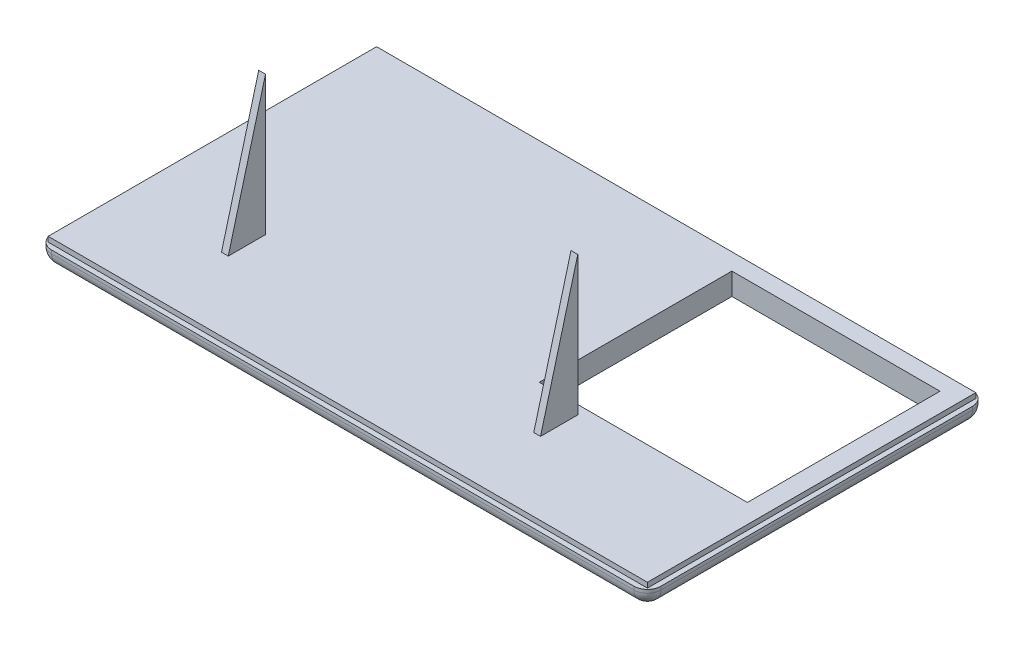
ISO-10303-21;
HEADER;
FILE_DESCRIPTION(('STEP AP214'),'2;1');
FILE_NAME('part.step','',(''),(''),'','','');
FILE_SCHEMA(('AUTOMOTIVE_DESIGN { 1 0 10303 214 1 1 1 1 }'));
ENDSEC;
DATA;
#1=APPLICATION_CONTEXT('core data for automotive mechanical design processes');
#2=APPLICATION_PROTOCOL_DEFINITION('international standard','automotive_design',2000,#1);
#3=PRODUCT_CONTEXT('',#1,'mechanical');
#4=PRODUCT('Part','Part','',(#3));
#5=PRODUCT_RELATED_PRODUCT_CATEGORY('part','',(#4));
#6=PRODUCT_DEFINITION_FORMATION('','',#4);
#7=PRODUCT_DEFINITION_CONTEXT('part definition',#1,'design');
#8=PRODUCT_DEFINITION('design','',#6,#7);
#9=PRODUCT_DEFINITION_SHAPE('','',#8);
#10=(LENGTH_UNIT() NAMED_UNIT(*) SI_UNIT(.MILLI.,.METRE.));
#11=(NAMED_UNIT(*) PLANE_ANGLE_UNIT() SI_UNIT($,.RADIAN.));
#12=(NAMED_UNIT(*) SI_UNIT($,.STERADIAN.) SOLID_ANGLE_UNIT());
#13=UNCERTAINTY_MEASURE_WITH_UNIT(LENGTH_MEASURE(1.E-05),#10,'distance_accuracy_value','');
#14=(GEOMETRIC_REPRESENTATION_CONTEXT(3) GLOBAL_UNCERTAINTY_ASSIGNED_CONTEXT((#13)) GLOBAL_UNIT_ASSIGNED_CONTEXT((#10,
#11,#12)) REPRESENTATION_CONTEXT('',''));
#15=CARTESIAN_POINT('',(0.,0.,0.));
#16=DIRECTION('',(0.,0.,1.));
#17=DIRECTION('',(1.,0.,0.));
#18=AXIS2_PLACEMENT_3D('',#15,#16,#17);
#19=CARTESIAN_POINT('',(-47.3378175730279,61.5,37.4277611940298));
#20=DIRECTION('',(-1.,0.,0.));
#21=DIRECTION('',(0.,0.,1.));
#22=AXIS2_PLACEMENT_3D('',#19,#20,#21);
#23=PLANE('',#22);
#24=DIRECTION('',(0.,0.,-1.));
#25=VECTOR('',#24,1.);
#26=CARTESIAN_POINT('',(-47.3378175730279,6.5,37.4277611940298));
#27=LINE('',#26,#25);
#28=CARTESIAN_POINT('',(-47.3378175730277,6.5,37.4277611940298));
#29=VERTEX_POINT('',#28);
#30=CARTESIAN_POINT('',(-47.3378175730279,6.5,26.4277611940298));
#31=VERTEX_POINT('',#30);
#32=EDGE_CURVE('E246',#29,#31,#27,.T.);
#33=ORIENTED_EDGE('',*,*,#32,.F.);
#34=DIRECTION('',(0.,0.965925826289069,-0.258819045102518));
#35=VECTOR('',#34,1.);
#36=CARTESIAN_POINT('',(-47.3378175730279,57.8156986040721,23.67776119403));
#37=LINE('',#36,#35);
#38=CARTESIAN_POINT('',(-47.3378175730279,47.5525588832581,26.4277611940298));
#39=VERTEX_POINT('',#38);
#40=EDGE_CURVE('E231',#29,#39,#37,.T.);
#41=ORIENTED_EDGE('',*,*,#40,.T.);
#42=DIRECTION('',(0.,-1.,0.));
#43=VECTOR('',#42,1.);
#44=CARTESIAN_POINT('',(-47.3378175730279,61.5,26.4277611940298));
#45=LINE('',#44,#43);
#46=EDGE_CURVE('E261',#39,#31,#45,.T.);
#47=ORIENTED_EDGE('',*,*,#46,.T.);
#48=EDGE_LOOP('',(#33,#41,#47));
#49=FACE_BOUND('',#48,.T.);
#50=ADVANCED_FACE('F41',(#49),#23,.T.);
#51=CARTESIAN_POINT('',(-45.3378175730279,61.5,37.4277611940298));
#52=DIRECTION('',(-1.,0.,0.));
#53=DIRECTION('',(0.,0.,1.));
#54=AXIS2_PLACEMENT_3D('',#51,#52,#53);
#55=PLANE('',#54);
#56=DIRECTION('',(0.,0.965925826289069,-0.258819045102518));
#57=VECTOR('',#56,1.);
#58=CARTESIAN_POINT('',(-45.3378175730279,57.8156986040721,23.67776119403));
#59=LINE('',#58,#57);
#60=CARTESIAN_POINT('',(-45.3378175730277,6.5,37.4277611940298));
#61=VERTEX_POINT('',#60);
#62=CARTESIAN_POINT('',(-45.3378175730279,47.5525588832581,26.4277611940298));
#63=VERTEX_POINT('',#62);
#64=EDGE_CURVE('E59',#61,#63,#59,.T.);
#65=ORIENTED_EDGE('',*,*,#64,.F.);
#66=DIRECTION('',(0.,0.,-1.));
#67=VECTOR('',#66,1.);
#68=CARTESIAN_POINT('',(-45.3378175730279,6.5,37.4277611940298));
#69=LINE('',#68,#67);
#70=CARTESIAN_POINT('',(-45.3378175730279,6.5,26.4277611940298));
#71=VERTEX_POINT('',#70);
#72=EDGE_CURVE('E254',#61,#71,#69,.T.);
#73=ORIENTED_EDGE('',*,*,#72,.T.);
#74=DIRECTION('',(0.,-1.,0.));
#75=VECTOR('',#74,1.);
#76=CARTESIAN_POINT('',(-45.3378175730279,61.5,26.4277611940298));
#77=LINE('',#76,#75);
#78=EDGE_CURVE('E262',#63,#71,#77,.T.);
#79=ORIENTED_EDGE('',*,*,#78,.F.);
#80=EDGE_LOOP('',(#65,#73,#79));
#81=FACE_BOUND('',#80,.T.);
#82=ADVANCED_FACE('F543',(#81),#55,.F.);
#83=CARTESIAN_POINT('',(-47.3378175730279,61.5,26.4277611940298));
#84=DIRECTION('',(0.,0.,-1.));
#85=DIRECTION('',(-1.,0.,0.));
#86=AXIS2_PLACEMENT_3D('',#83,#84,#85);
#87=PLANE('',#86);
#88=ORIENTED_EDGE('',*,*,#46,.F.);
#89=DIRECTION('',(1.,0.,0.));
#90=VECTOR('',#89,1.);
#91=CARTESIAN_POINT('',(-47.3378175730279,47.5525588832581,26.4277611940298));
#92=LINE('',#91,#90);
#93=EDGE_CURVE('E224',#39,#63,#92,.T.);
#94=ORIENTED_EDGE('',*,*,#93,.T.);
#95=ORIENTED_EDGE('',*,*,#78,.T.);
#96=DIRECTION('',(1.,0.,0.));
#97=VECTOR('',#96,1.);
#98=CARTESIAN_POINT('',(-47.3378175730279,6.5,26.4277611940298));
#99=LINE('',#98,#97);
#100=EDGE_CURVE('E250',#31,#71,#99,.T.);
#101=ORIENTED_EDGE('',*,*,#100,.F.);
#102=EDGE_LOOP('',(#88,#94,#95,#101));
#103=FACE_BOUND('',#102,.T.);
#104=ADVANCED_FACE('F550',(#103),#87,.T.);
#105=CARTESIAN_POINT('',(46.899277235528,61.5,37.4277611940298));
#106=DIRECTION('',(-1.,0.,0.));
#107=DIRECTION('',(0.,0.,1.));
#108=AXIS2_PLACEMENT_3D('',#105,#106,#107);
#109=PLANE('',#108);
#110=DIRECTION('',(0.,0.965925826289069,-0.258819045102518));
#111=VECTOR('',#110,1.);
#112=CARTESIAN_POINT('',(46.899277235528,57.8156986040721,23.67776119403));
#113=LINE('',#112,#111);
#114=CARTESIAN_POINT('',(46.8992772355281,6.5,37.4277611940298));
#115=VERTEX_POINT('',#114);
#116=CARTESIAN_POINT('',(46.899277235528,47.5525588832581,26.4277611940298));
#117=VERTEX_POINT('',#116);
#118=EDGE_CURVE('E208',#115,#117,#113,.T.);
#119=ORIENTED_EDGE('',*,*,#118,.F.);
#120=DIRECTION('',(0.,0.,-1.));
#121=VECTOR('',#120,1.);
#122=CARTESIAN_POINT('',(46.899277235528,6.5,37.4277611940298));
#123=LINE('',#122,#121);
#124=CARTESIAN_POINT('',(46.899277235528,6.5,26.4277611940298));
#125=VERTEX_POINT('',#124);
#126=EDGE_CURVE('E222',#115,#125,#123,.T.);
#127=ORIENTED_EDGE('',*,*,#126,.T.);
#128=DIRECTION('',(0.,-1.,0.));
#129=VECTOR('',#128,1.);
#130=CARTESIAN_POINT('',(46.899277235528,61.5,26.4277611940298));
#131=LINE('',#130,#129);
#132=EDGE_CURVE('E67',#117,#125,#131,.T.);
#133=ORIENTED_EDGE('',*,*,#132,.F.);
#134=EDGE_LOOP('',(#119,#127,#133));
#135=FACE_BOUND('',#134,.T.);
#136=ADVANCED_FACE('F221',(#135),#109,.F.);
#137=CARTESIAN_POINT('',(46.899277235528,61.5,26.4277611940298));
#138=DIRECTION('',(0.,0.,1.));
#139=DIRECTION('',(1.,0.,0.));
#140=AXIS2_PLACEMENT_3D('',#137,#138,#139);
#141=PLANE('',#140);
#142=DIRECTION('',(-1.,0.,0.));
#143=VECTOR('',#142,1.);
#144=CARTESIAN_POINT('',(46.899277235528,47.5525588832581,26.4277611940298));
#145=LINE('',#144,#143);
#146=CARTESIAN_POINT('',(44.899277235528,47.5525588832582,26.4277611940298));
#147=VERTEX_POINT('',#146);
#148=EDGE_CURVE('E225',#117,#147,#145,.T.);
#149=ORIENTED_EDGE('',*,*,#148,.F.);
#150=ORIENTED_EDGE('',*,*,#132,.T.);
#151=DIRECTION('',(-1.,0.,0.));
#152=VECTOR('',#151,1.);
#153=CARTESIAN_POINT('',(46.899277235528,6.5,26.4277611940298));
#154=LINE('',#153,#152);
#155=CARTESIAN_POINT('',(44.899277235528,6.5,26.4277611940298));
#156=VERTEX_POINT('',#155);
#157=EDGE_CURVE('E229',#125,#156,#154,.T.);
#158=ORIENTED_EDGE('',*,*,#157,.T.);
#159=DIRECTION('',(0.,-1.,0.));
#160=VECTOR('',#159,1.);
#161=CARTESIAN_POINT('',(44.899277235528,61.5,26.4277611940298));
#162=LINE('',#161,#160);
#163=EDGE_CURVE('E216',#147,#156,#162,.T.);
#164=ORIENTED_EDGE('',*,*,#163,.F.);
#165=EDGE_LOOP('',(#149,#150,#158,#164));
#166=FACE_BOUND('',#165,.T.);
#167=ADVANCED_FACE('F741',(#166),#141,.F.);
#168=CARTESIAN_POINT('',(44.899277235528,61.5,37.4277611940298));
#169=DIRECTION('',(-1.,0.,0.));
#170=DIRECTION('',(0.,0.,1.));
#171=AXIS2_PLACEMENT_3D('',#168,#169,#170);
#172=PLANE('',#171);
#173=DIRECTION('',(0.,0.,-1.));
#174=VECTOR('',#173,1.);
#175=CARTESIAN_POINT('',(44.899277235528,6.5,37.4277611940298));
#176=LINE('',#175,#174);
#177=CARTESIAN_POINT('',(44.899277235528,6.5,37.4277611940298));
#178=VERTEX_POINT('',#177);
#179=EDGE_CURVE('E217',#178,#156,#176,.T.);
#180=ORIENTED_EDGE('',*,*,#179,.F.);
#181=DIRECTION('',(0.,0.965925826289069,-0.258819045102518));
#182=VECTOR('',#181,1.);
#183=CARTESIAN_POINT('',(44.899277235528,57.8156986040721,23.67776119403));
#184=LINE('',#183,#182);
#185=EDGE_CURVE('E210',#178,#147,#184,.T.);
#186=ORIENTED_EDGE('',*,*,#185,.T.);
#187=ORIENTED_EDGE('',*,*,#163,.T.);
#188=EDGE_LOOP('',(#180,#186,#187));
#189=FACE_BOUND('',#188,.T.);
#190=ADVANCED_FACE('F538',(#189),#172,.T.);
#191=CARTESIAN_POINT('',(0.,6.5,0.));
#192=DIRECTION('',(0.,1.,0.));
#193=DIRECTION('',(0.,0.,1.));
#194=AXIS2_PLACEMENT_3D('',#191,#192,#193);
#195=PLANE('',#194);
#196=DIRECTION('',(1.,0.,0.));
#197=VECTOR('',#196,1.);
#198=CARTESIAN_POINT('',(-47.3378175730279,6.5,37.4277611940298));
#199=LINE('',#198,#197);
#200=EDGE_CURVE('E258',#29,#61,#199,.T.);
#201=ORIENTED_EDGE('',*,*,#200,.F.);
#202=ORIENTED_EDGE('',*,*,#32,.T.);
#203=ORIENTED_EDGE('',*,*,#100,.T.);
#204=ORIENTED_EDGE('',*,*,#72,.F.);
#205=EDGE_LOOP('',(#201,#202,#203,#204));
#206=FACE_BOUND('',#205,.T.);
#207=DIRECTION('',(-1.,0.,0.));
#208=VECTOR('',#207,1.);
#209=CARTESIAN_POINT('',(46.899277235528,6.5,37.4277611940298));
#210=LINE('',#209,#208);
#211=EDGE_CURVE('E205',#115,#178,#210,.T.);
#212=ORIENTED_EDGE('',*,*,#211,.T.);
#213=ORIENTED_EDGE('',*,*,#179,.T.);
#214=ORIENTED_EDGE('',*,*,#157,.F.);
#215=ORIENTED_EDGE('',*,*,#126,.F.);
#216=EDGE_LOOP('',(#212,#213,#214,#215));
#217=FACE_BOUND('',#216,.T.);
#218=DIRECTION('',(0.,0.,1.));
#219=VECTOR('',#218,1.);
#220=CARTESIAN_POINT('',(-77.0074626865672,6.5,-38.0522388059701));
#221=LINE('',#220,#219);
#222=CARTESIAN_POINT('',(-77.0074626865672,6.5,-38.0522388059701));
#223=VERTEX_POINT('',#222);
#224=CARTESIAN_POINT('',(-77.0074626865672,6.5,58.9477611940298));
#225=VERTEX_POINT('',#224);
#226=EDGE_CURVE('E311',#223,#225,#221,.T.);
#227=ORIENTED_EDGE('',*,*,#226,.T.);
#228=DIRECTION('',(1.,0.,0.));
#229=VECTOR('',#228,1.);
#230=CARTESIAN_POINT('',(-77.0074626865672,6.5,58.9477611940298));
#231=LINE('',#230,#229);
#232=CARTESIAN_POINT('',(99.9925373134328,6.5,58.9477611940299));
#233=VERTEX_POINT('',#232);
#234=EDGE_CURVE('E314',#225,#233,#231,.T.);
#235=ORIENTED_EDGE('',*,*,#234,.T.);
#236=DIRECTION('',(0.,0.,-1.));
#237=VECTOR('',#236,1.);
#238=CARTESIAN_POINT('',(99.9925373134328,6.5,-38.0522388059702));
#239=LINE('',#238,#237);
#240=CARTESIAN_POINT('',(99.9925373134328,6.5,-38.0522388059702));
#241=VERTEX_POINT('',#240);
#242=EDGE_CURVE('E318',#233,#241,#239,.T.);
#243=ORIENTED_EDGE('',*,*,#242,.T.);
#244=DIRECTION('',(-1.,0.,0.));
#245=VECTOR('',#244,1.);
#246=CARTESIAN_POINT('',(-77.0074626865672,6.5,-38.0522388059701));
#247=LINE('',#246,#245);
#248=EDGE_CURVE('E321',#241,#223,#247,.T.);
#249=ORIENTED_EDGE('',*,*,#248,.T.);
#250=EDGE_LOOP('',(#227,#235,#243,#249));
#251=FACE_BOUND('',#250,.T.);
#252=DIRECTION('',(1.,0.,0.));
#253=VECTOR('',#252,1.);
#254=CARTESIAN_POINT('',(32.8707658495504,6.5,23.769809345208));
#255=LINE('',#254,#253);
#256=CARTESIAN_POINT('',(32.8707658495504,6.5,23.769809345208));
#257=VERTEX_POINT('',#256);
#258=CARTESIAN_POINT('',(94.3387658495504,6.5,23.769809345208));
#259=VERTEX_POINT('',#258);
#260=EDGE_CURVE('E278',#257,#259,#255,.T.);
#261=ORIENTED_EDGE('',*,*,#260,.F.);
#262=DIRECTION('',(0.,0.,1.));
#263=VECTOR('',#262,1.);
#264=CARTESIAN_POINT('',(32.8707658495504,6.5,-33.126190654792));
#265=LINE('',#264,#263);
#266=CARTESIAN_POINT('',(32.8707658495504,6.5,-33.126190654792));
#267=VERTEX_POINT('',#266);
#268=EDGE_CURVE('E289',#267,#257,#265,.T.);
#269=ORIENTED_EDGE('',*,*,#268,.F.);
#270=DIRECTION('',(1.,0.,0.));
#271=VECTOR('',#270,1.);
#272=CARTESIAN_POINT('',(32.8707658495504,6.5,-33.126190654792));
#273=LINE('',#272,#271);
#274=CARTESIAN_POINT('',(94.3387658495504,6.5,-33.126190654792));
#275=VERTEX_POINT('',#274);
#276=EDGE_CURVE('E285',#267,#275,#273,.T.);
#277=ORIENTED_EDGE('',*,*,#276,.T.);
#278=DIRECTION('',(0.,0.,1.));
#279=VECTOR('',#278,1.);
#280=CARTESIAN_POINT('',(94.3387658495504,6.5,-33.126190654792));
#281=LINE('',#280,#279);
#282=EDGE_CURVE('E281',#275,#259,#281,.T.);
#283=ORIENTED_EDGE('',*,*,#282,.T.);
#284=EDGE_LOOP('',(#261,#269,#277,#283));
#285=FACE_BOUND('',#284,.T.);
#286=ADVANCED_FACE('F227',(#206,#217,#251,#285),#195,.T.);
#287=CARTESIAN_POINT('',(-78.5074626865672,5.,-39.5522388059702));
#288=DIRECTION('',(1.,0.,0.));
#289=DIRECTION('',(0.,0.,-1.));
#290=AXIS2_PLACEMENT_3D('',#287,#288,#289);
#291=PLANE('',#290);
#292=DIRECTION('',(0.,-1.,0.));
#293=VECTOR('',#292,1.);
#294=CARTESIAN_POINT('',(-78.5074626865672,5.,-35.5522388059701));
#295=LINE('',#294,#293);
#296=CARTESIAN_POINT('',(-78.5074626865672,5.,-35.5522388059701));
#297=VERTEX_POINT('',#296);
#298=CARTESIAN_POINT('',(-78.5074626865672,4.,-35.5522388059701));
#299=VERTEX_POINT('',#298);
#300=EDGE_CURVE('E377',#297,#299,#295,.T.);
#301=ORIENTED_EDGE('',*,*,#300,.T.);
#302=DIRECTION('',(0.,0.,1.));
#303=VECTOR('',#302,1.);
#304=CARTESIAN_POINT('',(-78.5074626865672,4.,-39.5522388059702));
#305=LINE('',#304,#303);
#306=CARTESIAN_POINT('',(-78.5074626865672,4.,56.4477611940298));
#307=VERTEX_POINT('',#306);
#308=EDGE_CURVE('E439',#299,#307,#305,.T.);
#309=ORIENTED_EDGE('',*,*,#308,.T.);
#310=DIRECTION('',(0.,-1.,0.));
#311=VECTOR('',#310,1.);
#312=CARTESIAN_POINT('',(-78.5074626865672,5.,56.4477611940298));
#313=LINE('',#312,#311);
#314=CARTESIAN_POINT('',(-78.5074626865672,5.,56.4477611940298));
#315=VERTEX_POINT('',#314);
#316=EDGE_CURVE('E381',#307,#315,#313,.F.);
#317=ORIENTED_EDGE('',*,*,#316,.T.);
#318=DIRECTION('',(0.,0.,1.));
#319=VECTOR('',#318,1.);
#320=CARTESIAN_POINT('',(-78.5074626865672,5.,-39.5522388059702));
#321=LINE('',#320,#319);
#322=EDGE_CURVE('E354',#297,#315,#321,.T.);
#323=ORIENTED_EDGE('',*,*,#322,.F.);
#324=EDGE_LOOP('',(#301,#309,#317,#323));
#325=FACE_BOUND('',#324,.T.);
#326=ADVANCED_FACE('F530',(#325),#291,.F.);
#327=CARTESIAN_POINT('',(-78.5074626865672,5.,60.4477611940299));
#328=DIRECTION('',(0.,0.,-1.));
#329=DIRECTION('',(-1.,0.,0.));
#330=AXIS2_PLACEMENT_3D('',#327,#328,#329);
#331=PLANE('',#330);
#332=DIRECTION('',(0.,-1.,0.));
#333=VECTOR('',#332,1.);
#334=CARTESIAN_POINT('',(-74.5074626865672,5.,60.4477611940299));
#335=LINE('',#334,#333);
#336=CARTESIAN_POINT('',(-74.5074626865672,5.,60.4477611940299));
#337=VERTEX_POINT('',#336);
#338=CARTESIAN_POINT('',(-74.5074626865672,4.,60.4477611940299));
#339=VERTEX_POINT('',#338);
#340=EDGE_CURVE('E373',#337,#339,#335,.T.);
#341=ORIENTED_EDGE('',*,*,#340,.T.);
#342=DIRECTION('',(1.,0.,0.));
#343=VECTOR('',#342,1.);
#344=CARTESIAN_POINT('',(-78.5074626865672,4.,60.4477611940299));
#345=LINE('',#344,#343);
#346=CARTESIAN_POINT('',(97.4925373134328,4.,60.4477611940299));
#347=VERTEX_POINT('',#346);
#348=EDGE_CURVE('E433',#339,#347,#345,.T.);
#349=ORIENTED_EDGE('',*,*,#348,.T.);
#350=DIRECTION('',(0.,-1.,0.));
#351=VECTOR('',#350,1.);
#352=CARTESIAN_POINT('',(97.4925373134328,5.,60.4477611940299));
#353=LINE('',#352,#351);
#354=CARTESIAN_POINT('',(97.4925373134327,5.,60.4477611940299));
#355=VERTEX_POINT('',#354);
#356=EDGE_CURVE('E370',#347,#355,#353,.F.);
#357=ORIENTED_EDGE('',*,*,#356,.T.);
#358=DIRECTION('',(1.,0.,0.));
#359=VECTOR('',#358,1.);
#360=CARTESIAN_POINT('',(-78.5074626865672,5.,60.4477611940299));
#361=LINE('',#360,#359);
#362=EDGE_CURVE('E358',#337,#355,#361,.T.);
#363=ORIENTED_EDGE('',*,*,#362,.F.);
#364=EDGE_LOOP('',(#341,#349,#357,#363));
#365=FACE_BOUND('',#364,.T.);
#366=ADVANCED_FACE('F488',(#365),#331,.F.);
#367=CARTESIAN_POINT('',(101.492537313433,5.,-39.5522388059702));
#368=DIRECTION('',(-1.,0.,0.));
#369=DIRECTION('',(0.,0.,1.));
#370=AXIS2_PLACEMENT_3D('',#367,#368,#369);
#371=PLANE('',#370);
#372=DIRECTION('',(0.,-1.,0.));
#373=VECTOR('',#372,1.);
#374=CARTESIAN_POINT('',(101.492537313433,5.,56.4477611940298));
#375=LINE('',#374,#373);
#376=CARTESIAN_POINT('',(101.492537313433,5.,56.4477611940298));
#377=VERTEX_POINT('',#376);
#378=CARTESIAN_POINT('',(101.492537313433,4.,56.4477611940298));
#379=VERTEX_POINT('',#378);
#380=EDGE_CURVE('E403',#377,#379,#375,.T.);
#381=ORIENTED_EDGE('',*,*,#380,.T.);
#382=DIRECTION('',(0.,0.,-1.));
#383=VECTOR('',#382,1.);
#384=CARTESIAN_POINT('',(101.492537313433,4.,-39.5522388059702));
#385=LINE('',#384,#383);
#386=CARTESIAN_POINT('',(101.492537313433,4.,-35.5522388059701));
#387=VERTEX_POINT('',#386);
#388=EDGE_CURVE('E414',#379,#387,#385,.T.);
#389=ORIENTED_EDGE('',*,*,#388,.T.);
#390=DIRECTION('',(0.,-1.,0.));
#391=VECTOR('',#390,1.);
#392=CARTESIAN_POINT('',(101.492537313433,5.,-35.5522388059701));
#393=LINE('',#392,#391);
#394=CARTESIAN_POINT('',(101.492537313433,5.,-35.5522388059701));
#395=VERTEX_POINT('',#394);
#396=EDGE_CURVE('E407',#387,#395,#393,.F.);
#397=ORIENTED_EDGE('',*,*,#396,.T.);
#398=DIRECTION('',(0.,0.,-1.));
#399=VECTOR('',#398,1.);
#400=CARTESIAN_POINT('',(101.492537313433,5.,-39.5522388059702));
#401=LINE('',#400,#399);
#402=EDGE_CURVE('E362',#377,#395,#401,.T.);
#403=ORIENTED_EDGE('',*,*,#402,.F.);
#404=EDGE_LOOP('',(#381,#389,#397,#403));
#405=FACE_BOUND('',#404,.T.);
#406=ADVANCED_FACE('F501',(#405),#371,.F.);
#407=CARTESIAN_POINT('',(-78.5074626865672,5.,-39.5522388059702));
#408=DIRECTION('',(0.,0.,1.));
#409=DIRECTION('',(1.,0.,0.));
#410=AXIS2_PLACEMENT_3D('',#407,#408,#409);
#411=PLANE('',#410);
#412=DIRECTION('',(0.,-1.,0.));
#413=VECTOR('',#412,1.);
#414=CARTESIAN_POINT('',(97.4925373134328,5.,-39.5522388059702));
#415=LINE('',#414,#413);
#416=CARTESIAN_POINT('',(97.4925373134327,5.,-39.5522388059702));
#417=VERTEX_POINT('',#416);
#418=CARTESIAN_POINT('',(97.4925373134328,4.,-39.5522388059702));
#419=VERTEX_POINT('',#418);
#420=EDGE_CURVE('E396',#417,#419,#415,.T.);
#421=ORIENTED_EDGE('',*,*,#420,.T.);
#422=DIRECTION('',(-1.,0.,0.));
#423=VECTOR('',#422,1.);
#424=CARTESIAN_POINT('',(-78.5074626865672,4.,-39.5522388059702));
#425=LINE('',#424,#423);
#426=CARTESIAN_POINT('',(-74.5074626865672,4.,-39.5522388059702));
#427=VERTEX_POINT('',#426);
#428=EDGE_CURVE('E11',#419,#427,#425,.T.);
#429=ORIENTED_EDGE('',*,*,#428,.T.);
#430=DIRECTION('',(0.,-1.,0.));
#431=VECTOR('',#430,1.);
#432=CARTESIAN_POINT('',(-74.5074626865672,5.,-39.5522388059702));
#433=LINE('',#432,#431);
#434=CARTESIAN_POINT('',(-74.5074626865672,5.,-39.5522388059702));
#435=VERTEX_POINT('',#434);
#436=EDGE_CURVE('E400',#427,#435,#433,.F.);
#437=ORIENTED_EDGE('',*,*,#436,.T.);
#438=DIRECTION('',(-1.,0.,0.));
#439=VECTOR('',#438,1.);
#440=CARTESIAN_POINT('',(-78.5074626865672,5.,-39.5522388059702));
#441=LINE('',#440,#439);
#442=EDGE_CURVE('E366',#417,#435,#441,.T.);
#443=ORIENTED_EDGE('',*,*,#442,.F.);
#444=EDGE_LOOP('',(#421,#429,#437,#443));
#445=FACE_BOUND('',#444,.T.);
#446=ADVANCED_FACE('F521',(#445),#411,.F.);
#447=CARTESIAN_POINT('',(0.,5.,0.));
#448=DIRECTION('',(0.,1.,0.));
#449=DIRECTION('',(0.,0.,1.));
#450=AXIS2_PLACEMENT_3D('',#447,#448,#449);
#451=PLANE('',#450);
#452=DIRECTION('',(0.,0.,1.));
#453=VECTOR('',#452,1.);
#454=CARTESIAN_POINT('',(-77.0074626865672,5.,-38.0522388059701));
#455=LINE('',#454,#453);
#456=CARTESIAN_POINT('',(-77.0074626865672,5.,-38.0522388059701));
#457=VERTEX_POINT('',#456);
#458=CARTESIAN_POINT('',(-77.0074626865672,5.,58.9477611940298));
#459=VERTEX_POINT('',#458);
#460=EDGE_CURVE('E310',#457,#459,#455,.T.);
#461=ORIENTED_EDGE('',*,*,#460,.F.);
#462=DIRECTION('',(-1.,0.,0.));
#463=VECTOR('',#462,1.);
#464=CARTESIAN_POINT('',(-77.0074626865672,5.,-38.0522388059701));
#465=LINE('',#464,#463);
#466=CARTESIAN_POINT('',(99.9925373134328,5.,-38.0522388059702));
#467=VERTEX_POINT('',#466);
#468=EDGE_CURVE('E315',#467,#457,#465,.T.);
#469=ORIENTED_EDGE('',*,*,#468,.F.);
#470=DIRECTION('',(0.,0.,-1.));
#471=VECTOR('',#470,1.);
#472=CARTESIAN_POINT('',(99.9925373134328,5.,-38.0522388059702));
#473=LINE('',#472,#471);
#474=CARTESIAN_POINT('',(99.9925373134328,5.,58.9477611940299));
#475=VERTEX_POINT('',#474);
#476=EDGE_CURVE('E332',#475,#467,#473,.T.);
#477=ORIENTED_EDGE('',*,*,#476,.F.);
#478=DIRECTION('',(1.,0.,0.));
#479=VECTOR('',#478,1.);
#480=CARTESIAN_POINT('',(-77.0074626865672,5.,58.9477611940298));
#481=LINE('',#480,#479);
#482=EDGE_CURVE('E328',#459,#475,#481,.T.);
#483=ORIENTED_EDGE('',*,*,#482,.F.);
#484=EDGE_LOOP('',(#461,#469,#477,#483));
#485=FACE_BOUND('',#484,.T.);
#486=ORIENTED_EDGE('',*,*,#322,.T.);
#487=CARTESIAN_POINT('',(-74.5074626865672,5.,56.4477611940298));
#488=DIRECTION('',(0.,1.,0.));
#489=DIRECTION('',(0.,0.,1.));
#490=AXIS2_PLACEMENT_3D('',#487,#488,#489);
#491=CIRCLE('',#490,4.);
#492=EDGE_CURVE('E393',#315,#337,#491,.T.);
#493=ORIENTED_EDGE('',*,*,#492,.T.);
#494=ORIENTED_EDGE('',*,*,#362,.T.);
#495=CARTESIAN_POINT('',(97.4925373134328,5.,56.4477611940298));
#496=DIRECTION('',(0.,1.,0.));
#497=DIRECTION('',(0.,0.,1.));
#498=AXIS2_PLACEMENT_3D('',#495,#496,#497);
#499=CIRCLE('',#498,4.);
#500=EDGE_CURVE('E384',#355,#377,#499,.T.);
#501=ORIENTED_EDGE('',*,*,#500,.T.);
#502=ORIENTED_EDGE('',*,*,#402,.T.);
#503=CARTESIAN_POINT('',(97.4925373134328,5.,-35.5522388059701));
#504=DIRECTION('',(0.,1.,0.));
#505=DIRECTION('',(0.,0.,1.));
#506=AXIS2_PLACEMENT_3D('',#503,#504,#505);
#507=CIRCLE('',#506,4.);
#508=EDGE_CURVE('E387',#395,#417,#507,.T.);
#509=ORIENTED_EDGE('',*,*,#508,.T.);
#510=ORIENTED_EDGE('',*,*,#442,.T.);
#511=CARTESIAN_POINT('',(-74.5074626865672,5.,-35.5522388059701));
#512=DIRECTION('',(0.,1.,0.));
#513=DIRECTION('',(0.,0.,1.));
#514=AXIS2_PLACEMENT_3D('',#511,#512,#513);
#515=CIRCLE('',#514,4.);
#516=EDGE_CURVE('E390',#435,#297,#515,.T.);
#517=ORIENTED_EDGE('',*,*,#516,.T.);
#518=EDGE_LOOP('',(#486,#493,#494,#501,#502,#509,#510,#517));
#519=FACE_BOUND('',#518,.T.);
#520=ADVANCED_FACE('F492',(#485,#519),#451,.T.);
#521=CARTESIAN_POINT('',(0.,0.,0.));
#522=DIRECTION('',(0.,1.,0.));
#523=DIRECTION('',(0.,0.,1.));
#524=AXIS2_PLACEMENT_3D('',#521,#522,#523);
#525=PLANE('',#524);
#526=DIRECTION('',(-1.,0.,0.));
#527=VECTOR('',#526,1.);
#528=CARTESIAN_POINT('',(0.,0.,-35.5522388059701));
#529=LINE('',#528,#527);
#530=CARTESIAN_POINT('',(-74.5074626865672,0.,-35.5522388059701));
#531=VERTEX_POINT('',#530);
#532=CARTESIAN_POINT('',(97.4925373134328,0.,-35.5522388059701));
#533=VERTEX_POINT('',#532);
#534=EDGE_CURVE('E417',#531,#533,#529,.F.);
#535=ORIENTED_EDGE('',*,*,#534,.T.);
#536=DIRECTION('',(0.,0.,-1.));
#537=VECTOR('',#536,1.);
#538=CARTESIAN_POINT('',(97.4925373134328,0.,0.));
#539=LINE('',#538,#537);
#540=CARTESIAN_POINT('',(97.4925373134328,0.,56.4477611940298));
#541=VERTEX_POINT('',#540);
#542=EDGE_CURVE('E426',#533,#541,#539,.F.);
#543=ORIENTED_EDGE('',*,*,#542,.T.);
#544=DIRECTION('',(1.,0.,0.));
#545=VECTOR('',#544,1.);
#546=CARTESIAN_POINT('',(0.,0.,56.4477611940298));
#547=LINE('',#546,#545);
#548=CARTESIAN_POINT('',(-74.5074626865672,0.,56.4477611940298));
#549=VERTEX_POINT('',#548);
#550=EDGE_CURVE('E423',#541,#549,#547,.F.);
#551=ORIENTED_EDGE('',*,*,#550,.T.);
#552=DIRECTION('',(0.,0.,1.));
#553=VECTOR('',#552,1.);
#554=CARTESIAN_POINT('',(-74.5074626865672,0.,0.));
#555=LINE('',#554,#553);
#556=EDGE_CURVE('E420',#549,#531,#555,.F.);
#557=ORIENTED_EDGE('',*,*,#556,.T.);
#558=EDGE_LOOP('',(#535,#543,#551,#557));
#559=FACE_BOUND('',#558,.T.);
#560=DIRECTION('',(0.,0.,-1.));
#561=VECTOR('',#560,1.);
#562=CARTESIAN_POINT('',(32.8707658495504,0.,-33.126190654792));
#563=LINE('',#562,#561);
#564=CARTESIAN_POINT('',(32.8707658495504,0.,23.769809345208));
#565=VERTEX_POINT('',#564);
#566=CARTESIAN_POINT('',(32.8707658495504,0.,-33.126190654792));
#567=VERTEX_POINT('',#566);
#568=EDGE_CURVE('E272',#565,#567,#563,.T.);
#569=ORIENTED_EDGE('',*,*,#568,.F.);
#570=DIRECTION('',(-1.,0.,0.));
#571=VECTOR('',#570,1.);
#572=CARTESIAN_POINT('',(32.8707658495504,0.,23.769809345208));
#573=LINE('',#572,#571);
#574=CARTESIAN_POINT('',(94.3387658495504,0.,23.769809345208));
#575=VERTEX_POINT('',#574);
#576=EDGE_CURVE('E275',#575,#565,#573,.T.);
#577=ORIENTED_EDGE('',*,*,#576,.F.);
#578=DIRECTION('',(0.,0.,-1.));
#579=VECTOR('',#578,1.);
#580=CARTESIAN_POINT('',(94.3387658495504,0.,-33.126190654792));
#581=LINE('',#580,#579);
#582=CARTESIAN_POINT('',(94.3387658495504,0.,-33.126190654792));
#583=VERTEX_POINT('',#582);
#584=EDGE_CURVE('E297',#575,#583,#581,.T.);
#585=ORIENTED_EDGE('',*,*,#584,.T.);
#586=DIRECTION('',(-1.,0.,0.));
#587=VECTOR('',#586,1.);
#588=CARTESIAN_POINT('',(32.8707658495504,0.,-33.126190654792));
#589=LINE('',#588,#587);
#590=EDGE_CURVE('E268',#583,#567,#589,.T.);
#591=ORIENTED_EDGE('',*,*,#590,.T.);
#592=EDGE_LOOP('',(#569,#577,#585,#591));
#593=FACE_BOUND('',#592,.T.);
#594=ADVANCED_FACE('F587',(#559,#593),#525,.F.);
#595=CARTESIAN_POINT('',(-77.0074626865672,6.5,-38.0522388059701));
#596=DIRECTION('',(1.,0.,0.));
#597=DIRECTION('',(0.,0.,-1.));
#598=AXIS2_PLACEMENT_3D('',#595,#596,#597);
#599=PLANE('',#598);
#600=ORIENTED_EDGE('',*,*,#460,.T.);
#601=DIRECTION('',(0.,-1.,0.));
#602=VECTOR('',#601,1.);
#603=CARTESIAN_POINT('',(-77.0074626865672,6.5,58.9477611940298));
#604=LINE('',#603,#602);
#605=EDGE_CURVE('E350',#225,#459,#604,.T.);
#606=ORIENTED_EDGE('',*,*,#605,.F.);
#607=ORIENTED_EDGE('',*,*,#226,.F.);
#608=DIRECTION('',(0.,-1.,0.));
#609=VECTOR('',#608,1.);
#610=CARTESIAN_POINT('',(-77.0074626865672,6.5,-38.0522388059701));
#611=LINE('',#610,#609);
#612=EDGE_CURVE('E324',#223,#457,#611,.T.);
#613=ORIENTED_EDGE('',*,*,#612,.T.);
#614=EDGE_LOOP('',(#600,#606,#607,#613));
#615=FACE_BOUND('',#614,.T.);
#616=ADVANCED_FACE('F583',(#615),#599,.F.);
#617=CARTESIAN_POINT('',(-77.0074626865672,6.5,58.9477611940298));
#618=DIRECTION('',(0.,0.,-1.));
#619=DIRECTION('',(-1.,0.,0.));
#620=AXIS2_PLACEMENT_3D('',#617,#618,#619);
#621=PLANE('',#620);
#622=ORIENTED_EDGE('',*,*,#482,.T.);
#623=DIRECTION('',(0.,-1.,0.));
#624=VECTOR('',#623,1.);
#625=CARTESIAN_POINT('',(99.9925373134328,6.5,58.9477611940299));
#626=LINE('',#625,#624);
#627=EDGE_CURVE('E346',#233,#475,#626,.T.);
#628=ORIENTED_EDGE('',*,*,#627,.F.);
#629=ORIENTED_EDGE('',*,*,#234,.F.);
#630=ORIENTED_EDGE('',*,*,#605,.T.);
#631=EDGE_LOOP('',(#622,#628,#629,#630));
#632=FACE_BOUND('',#631,.T.);
#633=ADVANCED_FACE('F579',(#632),#621,.F.);
#634=CARTESIAN_POINT('',(99.9925373134328,6.5,-38.0522388059702));
#635=DIRECTION('',(-1.,0.,0.));
#636=DIRECTION('',(0.,0.,1.));
#637=AXIS2_PLACEMENT_3D('',#634,#635,#636);
#638=PLANE('',#637);
#639=ORIENTED_EDGE('',*,*,#476,.T.);
#640=DIRECTION('',(0.,-1.,0.));
#641=VECTOR('',#640,1.);
#642=CARTESIAN_POINT('',(99.9925373134328,6.5,-38.0522388059702));
#643=LINE('',#642,#641);
#644=EDGE_CURVE('E342',#241,#467,#643,.T.);
#645=ORIENTED_EDGE('',*,*,#644,.F.);
#646=ORIENTED_EDGE('',*,*,#242,.F.);
#647=ORIENTED_EDGE('',*,*,#627,.T.);
#648=EDGE_LOOP('',(#639,#645,#646,#647));
#649=FACE_BOUND('',#648,.T.);
#650=ADVANCED_FACE('F575',(#649),#638,.F.);
#651=CARTESIAN_POINT('',(-77.0074626865672,6.5,-38.0522388059701));
#652=DIRECTION('',(0.,0.,1.));
#653=DIRECTION('',(1.,0.,0.));
#654=AXIS2_PLACEMENT_3D('',#651,#652,#653);
#655=PLANE('',#654);
#656=ORIENTED_EDGE('',*,*,#468,.T.);
#657=ORIENTED_EDGE('',*,*,#612,.F.);
#658=ORIENTED_EDGE('',*,*,#248,.F.);
#659=ORIENTED_EDGE('',*,*,#644,.T.);
#660=EDGE_LOOP('',(#656,#657,#658,#659));
#661=FACE_BOUND('',#660,.T.);
#662=ADVANCED_FACE('F570',(#661),#655,.F.);
#663=CARTESIAN_POINT('',(32.8707658495504,-0.00100000000000013,23.769809345208));
#664=DIRECTION('',(0.,0.,1.));
#665=DIRECTION('',(1.,0.,0.));
#666=AXIS2_PLACEMENT_3D('',#663,#664,#665);
#667=PLANE('',#666);
#668=ORIENTED_EDGE('',*,*,#576,.T.);
#669=DIRECTION('',(0.,1.,0.));
#670=VECTOR('',#669,1.);
#671=CARTESIAN_POINT('',(32.8707658495504,-0.00100000000000013,23.769809345208));
#672=LINE('',#671,#670);
#673=EDGE_CURVE('E294',#565,#257,#672,.T.);
#674=ORIENTED_EDGE('',*,*,#673,.T.);
#675=ORIENTED_EDGE('',*,*,#260,.T.);
#676=DIRECTION('',(0.,1.,0.));
#677=VECTOR('',#676,1.);
#678=CARTESIAN_POINT('',(94.3387658495504,-0.00100000000000013,23.769809345208));
#679=LINE('',#678,#677);
#680=EDGE_CURVE('E293',#575,#259,#679,.T.);
#681=ORIENTED_EDGE('',*,*,#680,.F.);
#682=EDGE_LOOP('',(#668,#674,#675,#681));
#683=FACE_BOUND('',#682,.T.);
#684=ADVANCED_FACE('F560',(#683),#667,.F.);
#685=CARTESIAN_POINT('',(32.8707658495504,-0.00100000000000013,-33.126190654792));
#686=DIRECTION('',(-1.,0.,0.));
#687=DIRECTION('',(0.,0.,1.));
#688=AXIS2_PLACEMENT_3D('',#685,#686,#687);
#689=PLANE('',#688);
#690=ORIENTED_EDGE('',*,*,#568,.T.);
#691=DIRECTION('',(0.,1.,0.));
#692=VECTOR('',#691,1.);
#693=CARTESIAN_POINT('',(32.8707658495504,-0.00100000000000013,-33.126190654792));
#694=LINE('',#693,#692);
#695=EDGE_CURVE('E298',#567,#267,#694,.T.);
#696=ORIENTED_EDGE('',*,*,#695,.T.);
#697=ORIENTED_EDGE('',*,*,#268,.T.);
#698=ORIENTED_EDGE('',*,*,#673,.F.);
#699=EDGE_LOOP('',(#690,#696,#697,#698));
#700=FACE_BOUND('',#699,.T.);
#701=ADVANCED_FACE('F556',(#700),#689,.F.);
#702=CARTESIAN_POINT('',(32.8707658495504,-0.00100000000000013,-33.126190654792));
#703=DIRECTION('',(0.,0.,1.));
#704=DIRECTION('',(1.,0.,0.));
#705=AXIS2_PLACEMENT_3D('',#702,#703,#704);
#706=PLANE('',#705);
#707=DIRECTION('',(0.,1.,0.));
#708=VECTOR('',#707,1.);
#709=CARTESIAN_POINT('',(94.3387658495504,-0.00100000000000013,-33.126190654792));
#710=LINE('',#709,#708);
#711=EDGE_CURVE('E301',#583,#275,#710,.T.);
#712=ORIENTED_EDGE('',*,*,#711,.T.);
#713=ORIENTED_EDGE('',*,*,#276,.F.);
#714=ORIENTED_EDGE('',*,*,#695,.F.);
#715=ORIENTED_EDGE('',*,*,#590,.F.);
#716=EDGE_LOOP('',(#712,#713,#714,#715));
#717=FACE_BOUND('',#716,.T.);
#718=ADVANCED_FACE('F559',(#717),#706,.T.);
#719=CARTESIAN_POINT('',(94.3387658495504,-0.00100000000000013,-33.126190654792));
#720=DIRECTION('',(-1.,0.,0.));
#721=DIRECTION('',(0.,0.,1.));
#722=AXIS2_PLACEMENT_3D('',#719,#720,#721);
#723=PLANE('',#722);
#724=ORIENTED_EDGE('',*,*,#680,.T.);
#725=ORIENTED_EDGE('',*,*,#282,.F.);
#726=ORIENTED_EDGE('',*,*,#711,.F.);
#727=ORIENTED_EDGE('',*,*,#584,.F.);
#728=EDGE_LOOP('',(#724,#725,#726,#727));
#729=FACE_BOUND('',#728,.T.);
#730=ADVANCED_FACE('F564',(#729),#723,.T.);
#731=CARTESIAN_POINT('',(-74.5074626865672,5.,56.4477611940298));
#732=DIRECTION('',(0.,-1.,0.));
#733=DIRECTION('',(0.,0.,-1.));
#734=AXIS2_PLACEMENT_3D('',#731,#732,#733);
#735=CYLINDRICAL_SURFACE('',#734,4.);
#736=ORIENTED_EDGE('',*,*,#316,.F.);
#737=CARTESIAN_POINT('',(-74.5074626865672,4.,56.4477611940298));
#738=DIRECTION('',(0.,-1.,0.));
#739=DIRECTION('',(0.,0.,-1.));
#740=AXIS2_PLACEMENT_3D('',#737,#738,#739);
#741=CIRCLE('',#740,4.);
#742=EDGE_CURVE('E436',#307,#339,#741,.F.);
#743=ORIENTED_EDGE('',*,*,#742,.T.);
#744=ORIENTED_EDGE('',*,*,#340,.F.);
#745=ORIENTED_EDGE('',*,*,#492,.F.);
#746=EDGE_LOOP('',(#736,#743,#744,#745));
#747=FACE_BOUND('',#746,.T.);
#748=ADVANCED_FACE('F484',(#747),#735,.T.);
#749=CARTESIAN_POINT('',(-74.5074626865672,5.,-35.5522388059701));
#750=DIRECTION('',(0.,-1.,0.));
#751=DIRECTION('',(0.,0.,-1.));
#752=AXIS2_PLACEMENT_3D('',#749,#750,#751);
#753=CYLINDRICAL_SURFACE('',#752,4.);
#754=ORIENTED_EDGE('',*,*,#436,.F.);
#755=CARTESIAN_POINT('',(-74.5074626865672,4.,-35.5522388059701));
#756=DIRECTION('',(0.,-1.,0.));
#757=DIRECTION('',(0.,0.,-1.));
#758=AXIS2_PLACEMENT_3D('',#755,#756,#757);
#759=CIRCLE('',#758,4.);
#760=EDGE_CURVE('E51',#427,#299,#759,.F.);
#761=ORIENTED_EDGE('',*,*,#760,.T.);
#762=ORIENTED_EDGE('',*,*,#300,.F.);
#763=ORIENTED_EDGE('',*,*,#516,.F.);
#764=EDGE_LOOP('',(#754,#761,#762,#763));
#765=FACE_BOUND('',#764,.T.);
#766=ADVANCED_FACE('F527',(#765),#753,.T.);
#767=CARTESIAN_POINT('',(97.4925373134328,5.,-35.5522388059701));
#768=DIRECTION('',(0.,-1.,0.));
#769=DIRECTION('',(0.,0.,-1.));
#770=AXIS2_PLACEMENT_3D('',#767,#768,#769);
#771=CYLINDRICAL_SURFACE('',#770,4.);
#772=ORIENTED_EDGE('',*,*,#396,.F.);
#773=CARTESIAN_POINT('',(97.4925373134328,4.,-35.5522388059701));
#774=DIRECTION('',(0.,-1.,0.));
#775=DIRECTION('',(0.,0.,-1.));
#776=AXIS2_PLACEMENT_3D('',#773,#774,#775);
#777=CIRCLE('',#776,4.);
#778=EDGE_CURVE('E410',#387,#419,#777,.F.);
#779=ORIENTED_EDGE('',*,*,#778,.T.);
#780=ORIENTED_EDGE('',*,*,#420,.F.);
#781=ORIENTED_EDGE('',*,*,#508,.F.);
#782=EDGE_LOOP('',(#772,#779,#780,#781));
#783=FACE_BOUND('',#782,.T.);
#784=ADVANCED_FACE('F517',(#783),#771,.T.);
#785=CARTESIAN_POINT('',(97.4925373134328,5.,56.4477611940298));
#786=DIRECTION('',(0.,-1.,0.));
#787=DIRECTION('',(0.,0.,-1.));
#788=AXIS2_PLACEMENT_3D('',#785,#786,#787);
#789=CYLINDRICAL_SURFACE('',#788,4.);
#790=ORIENTED_EDGE('',*,*,#356,.F.);
#791=CARTESIAN_POINT('',(97.4925373134328,4.,56.4477611940298));
#792=DIRECTION('',(0.,-1.,0.));
#793=DIRECTION('',(0.,0.,-1.));
#794=AXIS2_PLACEMENT_3D('',#791,#792,#793);
#795=CIRCLE('',#794,4.);
#796=EDGE_CURVE('E430',#347,#379,#795,.F.);
#797=ORIENTED_EDGE('',*,*,#796,.T.);
#798=ORIENTED_EDGE('',*,*,#380,.F.);
#799=ORIENTED_EDGE('',*,*,#500,.F.);
#800=EDGE_LOOP('',(#790,#797,#798,#799));
#801=FACE_BOUND('',#800,.T.);
#802=ADVANCED_FACE('F496',(#801),#789,.T.);
#803=CARTESIAN_POINT('',(-74.5074626865672,4.,56.4477611940298));
#804=DIRECTION('',(0.,1.,0.));
#805=DIRECTION('',(0.,0.,1.));
#806=AXIS2_PLACEMENT_3D('',#803,#804,#805);
#807=SPHERICAL_SURFACE('',#806,4.);
#808=CARTESIAN_POINT('',(-74.5074626865672,4.,56.4477611940298));
#809=DIRECTION('',(1.,0.,0.));
#810=DIRECTION('',(0.,0.,-1.));
#811=AXIS2_PLACEMENT_3D('',#808,#809,#810);
#812=CIRCLE('',#811,4.);
#813=EDGE_CURVE('E464',#339,#549,#812,.T.);
#814=ORIENTED_EDGE('',*,*,#813,.F.);
#815=ORIENTED_EDGE('',*,*,#742,.F.);
#816=CARTESIAN_POINT('',(-74.5074626865672,4.,56.4477611940298));
#817=DIRECTION('',(0.,0.,-1.));
#818=DIRECTION('',(-1.,0.,0.));
#819=AXIS2_PLACEMENT_3D('',#816,#817,#818);
#820=CIRCLE('',#819,4.);
#821=EDGE_CURVE('E45',#549,#307,#820,.T.);
#822=ORIENTED_EDGE('',*,*,#821,.F.);
#823=EDGE_LOOP('',(#814,#815,#822));
#824=FACE_BOUND('',#823,.T.);
#825=ADVANCED_FACE('F43',(#824),#807,.T.);
#826=CARTESIAN_POINT('',(-74.5074626865672,4.,-39.5522388059702));
#827=DIRECTION('',(0.,0.,1.));
#828=DIRECTION('',(1.,0.,0.));
#829=AXIS2_PLACEMENT_3D('',#826,#827,#828);
#830=CYLINDRICAL_SURFACE('',#829,4.);
#831=ORIENTED_EDGE('',*,*,#821,.T.);
#832=ORIENTED_EDGE('',*,*,#308,.F.);
#833=CARTESIAN_POINT('',(-74.5074626865672,4.,-35.5522388059701));
#834=DIRECTION('',(0.,0.,-1.));
#835=DIRECTION('',(-1.,0.,0.));
#836=AXIS2_PLACEMENT_3D('',#833,#834,#835);
#837=CIRCLE('',#836,4.);
#838=EDGE_CURVE('E461',#531,#299,#837,.T.);
#839=ORIENTED_EDGE('',*,*,#838,.F.);
#840=ORIENTED_EDGE('',*,*,#556,.F.);
#841=EDGE_LOOP('',(#831,#832,#839,#840));
#842=FACE_BOUND('',#841,.T.);
#843=ADVANCED_FACE('F477',(#842),#830,.T.);
#844=CARTESIAN_POINT('',(-78.5074626865672,4.,56.4477611940298));
#845=DIRECTION('',(1.,0.,0.));
#846=DIRECTION('',(0.,0.,-1.));
#847=AXIS2_PLACEMENT_3D('',#844,#845,#846);
#848=CYLINDRICAL_SURFACE('',#847,4.);
#849=ORIENTED_EDGE('',*,*,#813,.T.);
#850=ORIENTED_EDGE('',*,*,#550,.F.);
#851=CARTESIAN_POINT('',(97.4925373134328,4.,56.4477611940298));
#852=DIRECTION('',(1.,0.,0.));
#853=DIRECTION('',(0.,0.,-1.));
#854=AXIS2_PLACEMENT_3D('',#851,#852,#853);
#855=CIRCLE('',#854,4.);
#856=EDGE_CURVE('E457',#347,#541,#855,.T.);
#857=ORIENTED_EDGE('',*,*,#856,.F.);
#858=ORIENTED_EDGE('',*,*,#348,.F.);
#859=EDGE_LOOP('',(#849,#850,#857,#858));
#860=FACE_BOUND('',#859,.T.);
#861=ADVANCED_FACE('F685',(#860),#848,.T.);
#862=CARTESIAN_POINT('',(-74.5074626865672,4.,-35.5522388059701));
#863=DIRECTION('',(0.,1.,0.));
#864=DIRECTION('',(0.,0.,1.));
#865=AXIS2_PLACEMENT_3D('',#862,#863,#864);
#866=SPHERICAL_SURFACE('',#865,4.);
#867=ORIENTED_EDGE('',*,*,#838,.T.);
#868=ORIENTED_EDGE('',*,*,#760,.F.);
#869=CARTESIAN_POINT('',(-74.5074626865672,4.,-35.5522388059701));
#870=DIRECTION('',(1.,0.,0.));
#871=DIRECTION('',(0.,0.,-1.));
#872=AXIS2_PLACEMENT_3D('',#869,#870,#871);
#873=CIRCLE('',#872,4.);
#874=EDGE_CURVE('E453',#531,#427,#873,.T.);
#875=ORIENTED_EDGE('',*,*,#874,.F.);
#876=EDGE_LOOP('',(#867,#868,#875));
#877=FACE_BOUND('',#876,.T.);
#878=ADVANCED_FACE('F691',(#877),#866,.T.);
#879=CARTESIAN_POINT('',(97.4925373134328,4.,56.4477611940298));
#880=DIRECTION('',(0.,1.,0.));
#881=DIRECTION('',(0.,0.,1.));
#882=AXIS2_PLACEMENT_3D('',#879,#880,#881);
#883=SPHERICAL_SURFACE('',#882,4.);
#884=ORIENTED_EDGE('',*,*,#796,.F.);
#885=ORIENTED_EDGE('',*,*,#856,.T.);
#886=CARTESIAN_POINT('',(97.4925373134328,4.,56.4477611940298));
#887=DIRECTION('',(0.,0.,-1.));
#888=DIRECTION('',(-1.,0.,0.));
#889=AXIS2_PLACEMENT_3D('',#886,#887,#888);
#890=CIRCLE('',#889,4.);
#891=EDGE_CURVE('E450',#379,#541,#890,.T.);
#892=ORIENTED_EDGE('',*,*,#891,.F.);
#893=EDGE_LOOP('',(#884,#885,#892));
#894=FACE_BOUND('',#893,.T.);
#895=ADVANCED_FACE('F505',(#894),#883,.T.);
#896=CARTESIAN_POINT('',(-78.5074626865672,4.,-35.5522388059701));
#897=DIRECTION('',(-1.,0.,0.));
#898=DIRECTION('',(0.,0.,1.));
#899=AXIS2_PLACEMENT_3D('',#896,#897,#898);
#900=CYLINDRICAL_SURFACE('',#899,4.);
#901=ORIENTED_EDGE('',*,*,#874,.T.);
#902=ORIENTED_EDGE('',*,*,#428,.F.);
#903=CARTESIAN_POINT('',(97.4925373134328,4.,-35.5522388059701));
#904=DIRECTION('',(1.,0.,0.));
#905=DIRECTION('',(0.,0.,-1.));
#906=AXIS2_PLACEMENT_3D('',#903,#904,#905);
#907=CIRCLE('',#906,4.);
#908=EDGE_CURVE('E447',#533,#419,#907,.T.);
#909=ORIENTED_EDGE('',*,*,#908,.F.);
#910=ORIENTED_EDGE('',*,*,#534,.F.);
#911=EDGE_LOOP('',(#901,#902,#909,#910));
#912=FACE_BOUND('',#911,.T.);
#913=ADVANCED_FACE('F705',(#912),#900,.T.);
#914=CARTESIAN_POINT('',(97.4925373134328,4.,-39.5522388059702));
#915=DIRECTION('',(0.,0.,-1.));
#916=DIRECTION('',(-1.,0.,0.));
#917=AXIS2_PLACEMENT_3D('',#914,#915,#916);
#918=CYLINDRICAL_SURFACE('',#917,4.);
#919=ORIENTED_EDGE('',*,*,#891,.T.);
#920=ORIENTED_EDGE('',*,*,#542,.F.);
#921=CARTESIAN_POINT('',(97.4925373134328,4.,-35.5522388059701));
#922=DIRECTION('',(0.,0.,-1.));
#923=DIRECTION('',(-1.,0.,0.));
#924=AXIS2_PLACEMENT_3D('',#921,#922,#923);
#925=CIRCLE('',#924,4.);
#926=EDGE_CURVE('E265',#387,#533,#925,.T.);
#927=ORIENTED_EDGE('',*,*,#926,.F.);
#928=ORIENTED_EDGE('',*,*,#388,.F.);
#929=EDGE_LOOP('',(#919,#920,#927,#928));
#930=FACE_BOUND('',#929,.T.);
#931=ADVANCED_FACE('F509',(#930),#918,.T.);
#932=CARTESIAN_POINT('',(97.4925373134328,4.,-35.5522388059701));
#933=DIRECTION('',(0.,1.,0.));
#934=DIRECTION('',(0.,0.,1.));
#935=AXIS2_PLACEMENT_3D('',#932,#933,#934);
#936=SPHERICAL_SURFACE('',#935,4.);
#937=ORIENTED_EDGE('',*,*,#908,.T.);
#938=ORIENTED_EDGE('',*,*,#778,.F.);
#939=ORIENTED_EDGE('',*,*,#926,.T.);
#940=EDGE_LOOP('',(#937,#938,#939));
#941=FACE_BOUND('',#940,.T.);
#942=ADVANCED_FACE('F513',(#941),#936,.T.);
#943=CARTESIAN_POINT('',(470.408400136309,6.5,37.4277611940298));
#944=DIRECTION('',(0.,0.258819045102518,0.965925826289069));
#945=DIRECTION('',(0.,-0.965925826289069,0.258819045102518));
#946=AXIS2_PLACEMENT_3D('',#943,#944,#945);
#947=PLANE('',#946);
#948=ORIENTED_EDGE('',*,*,#211,.F.);
#949=ORIENTED_EDGE('',*,*,#118,.T.);
#950=ORIENTED_EDGE('',*,*,#148,.T.);
#951=ORIENTED_EDGE('',*,*,#185,.F.);
#952=EDGE_LOOP('',(#948,#949,#950,#951));
#953=FACE_BOUND('',#952,.T.);
#954=ADVANCED_FACE('F207',(#953),#947,.T.);
#955=ORIENTED_EDGE('',*,*,#40,.F.);
#956=ORIENTED_EDGE('',*,*,#200,.T.);
#957=ORIENTED_EDGE('',*,*,#64,.T.);
#958=ORIENTED_EDGE('',*,*,#93,.F.);
#959=EDGE_LOOP('',(#955,#956,#957,#958));
#960=FACE_BOUND('',#959,.T.);
#961=ADVANCED_FACE('F779',(#960),#947,.T.);
#962=CLOSED_SHELL('',(#50,#82,#104,#136,#167,#190,#286,#326,#366,#406,#446,#520,#594,#616,#633,
#650,#662,#684,#701,#718,#730,#748,#766,#784,#802,#825,#843,#861,#878,#895,#913,#931,#942,#954,#961));
#963=MANIFOLD_SOLID_BREP('B2',#962);
#964=ADVANCED_BREP_SHAPE_REPRESENTATION('',(#18,#963),#14);
#965=SHAPE_DEFINITION_REPRESENTATION(#9,#964);
ENDSEC;
END-ISO-10303-21;
